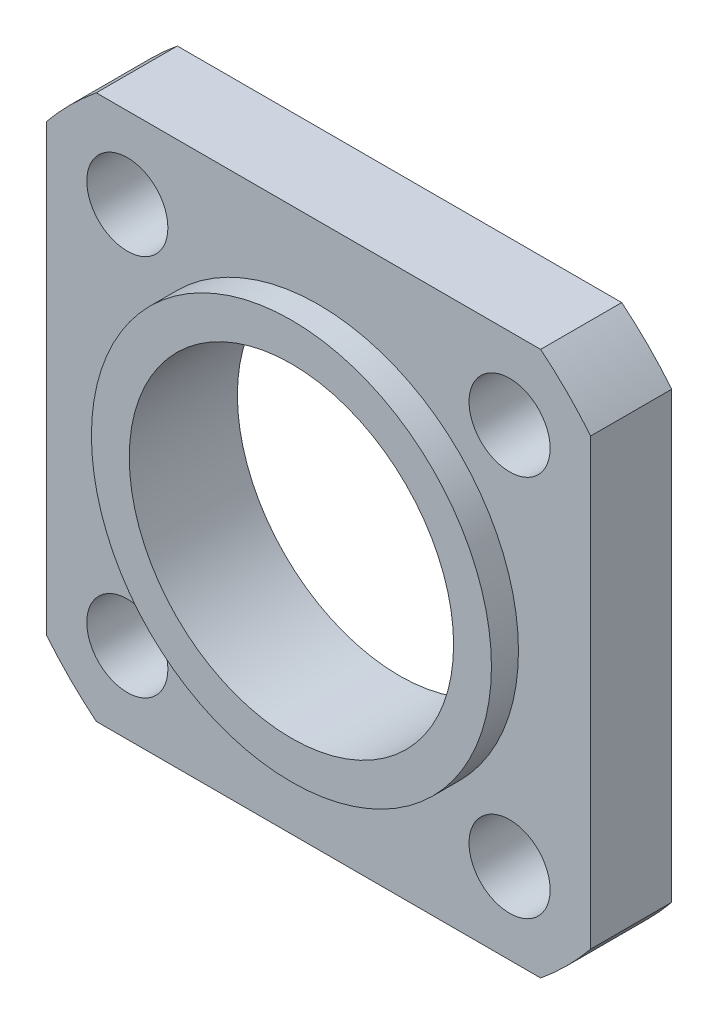
ISO-10303-21;
HEADER;
FILE_DESCRIPTION(('STEP AP214'),'2;1');
FILE_NAME('part.step','',(''),(''),'','','');
FILE_SCHEMA(('AUTOMOTIVE_DESIGN { 1 0 10303 214 1 1 1 1 }'));
ENDSEC;
DATA;
#1=APPLICATION_CONTEXT('core data for automotive mechanical design processes');
#2=APPLICATION_PROTOCOL_DEFINITION('international standard','automotive_design',2000,#1);
#3=PRODUCT_CONTEXT('',#1,'mechanical');
#4=PRODUCT('Part','Part','',(#3));
#5=PRODUCT_RELATED_PRODUCT_CATEGORY('part','',(#4));
#6=PRODUCT_DEFINITION_FORMATION('','',#4);
#7=PRODUCT_DEFINITION_CONTEXT('part definition',#1,'design');
#8=PRODUCT_DEFINITION('design','',#6,#7);
#9=PRODUCT_DEFINITION_SHAPE('','',#8);
#10=(LENGTH_UNIT() NAMED_UNIT(*) SI_UNIT(.MILLI.,.METRE.));
#11=(NAMED_UNIT(*) PLANE_ANGLE_UNIT() SI_UNIT($,.RADIAN.));
#12=(NAMED_UNIT(*) SI_UNIT($,.STERADIAN.) SOLID_ANGLE_UNIT());
#13=UNCERTAINTY_MEASURE_WITH_UNIT(LENGTH_MEASURE(1.E-05),#10,'distance_accuracy_value','');
#14=(GEOMETRIC_REPRESENTATION_CONTEXT(3) GLOBAL_UNCERTAINTY_ASSIGNED_CONTEXT((#13)) GLOBAL_UNIT_ASSIGNED_CONTEXT((#10,
#11,#12)) REPRESENTATION_CONTEXT('',''));
#15=CARTESIAN_POINT('',(0.,0.,0.));
#16=DIRECTION('',(0.,0.,1.));
#17=DIRECTION('',(1.,0.,0.));
#18=AXIS2_PLACEMENT_3D('',#15,#16,#17);
#19=CARTESIAN_POINT('',(0.,0.,3.));
#20=DIRECTION('',(0.,0.,-1.));
#21=DIRECTION('',(-1.,0.,0.));
#22=AXIS2_PLACEMENT_3D('',#19,#20,#21);
#23=CYLINDRICAL_SURFACE('',#22,13.);
#24=CARTESIAN_POINT('',(0.,0.,3.));
#25=DIRECTION('',(0.,0.,1.));
#26=DIRECTION('',(1.,0.,0.));
#27=AXIS2_PLACEMENT_3D('',#24,#25,#26);
#28=CIRCLE('',#27,13.);
#29=CARTESIAN_POINT('',(-8.22031587767818,10.0710678118654,3.));
#30=VERTEX_POINT('',#29);
#31=CARTESIAN_POINT('',(-10.0710678118654,8.22031587767818,3.));
#32=VERTEX_POINT('',#31);
#33=EDGE_CURVE('E118',#30,#32,#28,.T.);
#34=ORIENTED_EDGE('',*,*,#33,.F.);
#35=DIRECTION('',(0.,0.,-1.));
#36=VECTOR('',#35,1.);
#37=CARTESIAN_POINT('',(-8.22031587767818,10.0710678118654,3.));
#38=LINE('',#37,#36);
#39=CARTESIAN_POINT('',(-8.22031587767818,10.0710678118654,0.));
#40=VERTEX_POINT('',#39);
#41=EDGE_CURVE('E11',#30,#40,#38,.T.);
#42=ORIENTED_EDGE('',*,*,#41,.T.);
#43=CARTESIAN_POINT('',(0.,0.,0.));
#44=DIRECTION('',(0.,0.,1.));
#45=DIRECTION('',(1.,0.,0.));
#46=AXIS2_PLACEMENT_3D('',#43,#44,#45);
#47=CIRCLE('',#46,13.);
#48=CARTESIAN_POINT('',(-10.0710678118654,8.22031587767818,0.));
#49=VERTEX_POINT('',#48);
#50=EDGE_CURVE('E141',#40,#49,#47,.T.);
#51=ORIENTED_EDGE('',*,*,#50,.T.);
#52=DIRECTION('',(0.,0.,-1.));
#53=VECTOR('',#52,1.);
#54=CARTESIAN_POINT('',(-10.0710678118654,8.22031587767818,3.));
#55=LINE('',#54,#53);
#56=EDGE_CURVE('E125',#49,#32,#55,.F.);
#57=ORIENTED_EDGE('',*,*,#56,.T.);
#58=EDGE_LOOP('',(#34,#42,#51,#57));
#59=FACE_BOUND('',#58,.T.);
#60=ADVANCED_FACE('F38',(#59),#23,.T.);
#61=CARTESIAN_POINT('',(10.0710678118654,8.22031587767818,0.));
#62=VERTEX_POINT('',#61);
#63=CARTESIAN_POINT('',(8.22031587767818,10.0710678118654,0.));
#64=VERTEX_POINT('',#63);
#65=EDGE_CURVE('E137',#62,#64,#47,.T.);
#66=ORIENTED_EDGE('',*,*,#65,.T.);
#67=DIRECTION('',(0.,0.,-1.));
#68=VECTOR('',#67,1.);
#69=CARTESIAN_POINT('',(8.22031587767818,10.0710678118654,3.));
#70=LINE('',#69,#68);
#71=CARTESIAN_POINT('',(8.22031587767818,10.0710678118654,3.));
#72=VERTEX_POINT('',#71);
#73=EDGE_CURVE('E47',#64,#72,#70,.F.);
#74=ORIENTED_EDGE('',*,*,#73,.T.);
#75=CARTESIAN_POINT('',(10.0710678118654,8.22031587767818,3.));
#76=VERTEX_POINT('',#75);
#77=EDGE_CURVE('E120',#76,#72,#28,.T.);
#78=ORIENTED_EDGE('',*,*,#77,.F.);
#79=DIRECTION('',(0.,0.,-1.));
#80=VECTOR('',#79,1.);
#81=CARTESIAN_POINT('',(10.0710678118654,8.22031587767818,3.));
#82=LINE('',#81,#80);
#83=EDGE_CURVE('E159',#76,#62,#82,.T.);
#84=ORIENTED_EDGE('',*,*,#83,.T.);
#85=EDGE_LOOP('',(#66,#74,#78,#84));
#86=FACE_BOUND('',#85,.T.);
#87=ADVANCED_FACE('F164',(#86),#23,.T.);
#88=CARTESIAN_POINT('',(8.22031587767818,-10.0710678118654,0.));
#89=VERTEX_POINT('',#88);
#90=CARTESIAN_POINT('',(10.0710678118654,-8.22031587767818,0.));
#91=VERTEX_POINT('',#90);
#92=EDGE_CURVE('E142',#89,#91,#47,.T.);
#93=ORIENTED_EDGE('',*,*,#92,.T.);
#94=DIRECTION('',(0.,0.,-1.));
#95=VECTOR('',#94,1.);
#96=CARTESIAN_POINT('',(10.0710678118654,-8.22031587767818,3.));
#97=LINE('',#96,#95);
#98=CARTESIAN_POINT('',(10.0710678118654,-8.22031587767818,3.));
#99=VERTEX_POINT('',#98);
#100=EDGE_CURVE('E156',#91,#99,#97,.F.);
#101=ORIENTED_EDGE('',*,*,#100,.T.);
#102=CARTESIAN_POINT('',(8.22031587767818,-10.0710678118654,3.));
#103=VERTEX_POINT('',#102);
#104=EDGE_CURVE('E131',#103,#99,#28,.T.);
#105=ORIENTED_EDGE('',*,*,#104,.F.);
#106=DIRECTION('',(0.,0.,-1.));
#107=VECTOR('',#106,1.);
#108=CARTESIAN_POINT('',(8.22031587767818,-10.0710678118654,3.));
#109=LINE('',#108,#107);
#110=EDGE_CURVE('E152',#103,#89,#109,.T.);
#111=ORIENTED_EDGE('',*,*,#110,.T.);
#112=EDGE_LOOP('',(#93,#101,#105,#111));
#113=FACE_BOUND('',#112,.T.);
#114=ADVANCED_FACE('F245',(#113),#23,.T.);
#115=CARTESIAN_POINT('',(0.,0.,3.));
#116=DIRECTION('',(0.,0.,1.));
#117=DIRECTION('',(1.,0.,0.));
#118=AXIS2_PLACEMENT_3D('',#115,#116,#117);
#119=PLANE('',#118);
#120=DIRECTION('',(1.,0.,0.));
#121=VECTOR('',#120,1.);
#122=CARTESIAN_POINT('',(-8.22031587767818,10.0710678118654,3.));
#123=LINE('',#122,#121);
#124=EDGE_CURVE('E104',#30,#72,#123,.T.);
#125=ORIENTED_EDGE('',*,*,#124,.F.);
#126=ORIENTED_EDGE('',*,*,#33,.T.);
#127=DIRECTION('',(0.,1.,0.));
#128=VECTOR('',#127,1.);
#129=CARTESIAN_POINT('',(-10.0710678118654,-8.22031587767818,3.));
#130=LINE('',#129,#128);
#131=CARTESIAN_POINT('',(-10.0710678118654,-8.22031587767818,3.));
#132=VERTEX_POINT('',#131);
#133=EDGE_CURVE('E382',#132,#32,#130,.T.);
#134=ORIENTED_EDGE('',*,*,#133,.F.);
#135=CARTESIAN_POINT('',(-8.22031587767818,-10.0710678118654,3.));
#136=VERTEX_POINT('',#135);
#137=EDGE_CURVE('E127',#132,#136,#28,.T.);
#138=ORIENTED_EDGE('',*,*,#137,.T.);
#139=DIRECTION('',(-1.,0.,0.));
#140=VECTOR('',#139,1.);
#141=CARTESIAN_POINT('',(8.22031587767818,-10.0710678118654,3.));
#142=LINE('',#141,#140);
#143=EDGE_CURVE('E62',#103,#136,#142,.T.);
#144=ORIENTED_EDGE('',*,*,#143,.F.);
#145=ORIENTED_EDGE('',*,*,#104,.T.);
#146=DIRECTION('',(0.,-1.,0.));
#147=VECTOR('',#146,1.);
#148=CARTESIAN_POINT('',(10.0710678118654,8.22031587767818,3.));
#149=LINE('',#148,#147);
#150=EDGE_CURVE('E54',#76,#99,#149,.T.);
#151=ORIENTED_EDGE('',*,*,#150,.F.);
#152=ORIENTED_EDGE('',*,*,#77,.T.);
#153=EDGE_LOOP('',(#125,#126,#134,#138,#144,#145,#151,#152));
#154=FACE_BOUND('',#153,.T.);
#155=CARTESIAN_POINT('',(-7.07106781186543,-7.07106781186552,3.));
#156=DIRECTION('',(0.,0.,1.));
#157=DIRECTION('',(1.,0.,0.));
#158=AXIS2_PLACEMENT_3D('',#155,#156,#157);
#159=CIRCLE('',#158,1.5);
#160=CARTESIAN_POINT('',(-5.57106781186543,-7.07106781186552,3.));
#161=VERTEX_POINT('',#160);
#162=EDGE_CURVE('E192',#161,#161,#159,.T.);
#163=ORIENTED_EDGE('',*,*,#162,.F.);
#164=EDGE_LOOP('',(#163));
#165=FACE_BOUND('',#164,.T.);
#166=CARTESIAN_POINT('',(7.07106781186543,7.07106781186551,3.));
#167=DIRECTION('',(0.,0.,1.));
#168=DIRECTION('',(1.,0.,0.));
#169=AXIS2_PLACEMENT_3D('',#166,#167,#168);
#170=CIRCLE('',#169,1.5);
#171=CARTESIAN_POINT('',(8.57106781186543,7.07106781186551,3.));
#172=VERTEX_POINT('',#171);
#173=EDGE_CURVE('E208',#172,#172,#170,.T.);
#174=ORIENTED_EDGE('',*,*,#173,.F.);
#175=EDGE_LOOP('',(#174));
#176=FACE_BOUND('',#175,.T.);
#177=CARTESIAN_POINT('',(-7.07106781186551,7.07106781186543,3.));
#178=DIRECTION('',(0.,0.,1.));
#179=DIRECTION('',(1.,0.,0.));
#180=AXIS2_PLACEMENT_3D('',#177,#178,#179);
#181=CIRCLE('',#180,1.5);
#182=CARTESIAN_POINT('',(-5.57106781186551,7.07106781186543,3.));
#183=VERTEX_POINT('',#182);
#184=EDGE_CURVE('E216',#183,#183,#181,.T.);
#185=ORIENTED_EDGE('',*,*,#184,.F.);
#186=EDGE_LOOP('',(#185));
#187=FACE_BOUND('',#186,.T.);
#188=CARTESIAN_POINT('',(7.07106781186552,-7.07106781186543,3.));
#189=DIRECTION('',(0.,0.,1.));
#190=DIRECTION('',(1.,0.,0.));
#191=AXIS2_PLACEMENT_3D('',#188,#189,#190);
#192=CIRCLE('',#191,1.5);
#193=CARTESIAN_POINT('',(8.57106781186551,-7.07106781186543,3.));
#194=VERTEX_POINT('',#193);
#195=EDGE_CURVE('E200',#194,#194,#192,.T.);
#196=ORIENTED_EDGE('',*,*,#195,.F.);
#197=EDGE_LOOP('',(#196));
#198=FACE_BOUND('',#197,.T.);
#199=CARTESIAN_POINT('',(0.,0.,3.));
#200=DIRECTION('',(0.,0.,1.));
#201=DIRECTION('',(1.,0.,0.));
#202=AXIS2_PLACEMENT_3D('',#199,#200,#201);
#203=CIRCLE('',#202,7.4);
#204=CARTESIAN_POINT('',(7.4,0.,3.));
#205=VERTEX_POINT('',#204);
#206=EDGE_CURVE('E178',#205,#205,#203,.T.);
#207=ORIENTED_EDGE('',*,*,#206,.F.);
#208=EDGE_LOOP('',(#207));
#209=FACE_BOUND('',#208,.T.);
#210=ADVANCED_FACE('F115',(#154,#165,#176,#187,#198,#209),#119,.T.);
#211=CARTESIAN_POINT('',(0.,0.,0.));
#212=DIRECTION('',(0.,0.,1.));
#213=DIRECTION('',(1.,0.,0.));
#214=AXIS2_PLACEMENT_3D('',#211,#212,#213);
#215=PLANE('',#214);
#216=ORIENTED_EDGE('',*,*,#50,.F.);
#217=DIRECTION('',(1.,0.,0.));
#218=VECTOR('',#217,1.);
#219=CARTESIAN_POINT('',(0.,10.0710678118654,0.));
#220=LINE('',#219,#218);
#221=EDGE_CURVE('E107',#40,#64,#220,.T.);
#222=ORIENTED_EDGE('',*,*,#221,.T.);
#223=ORIENTED_EDGE('',*,*,#65,.F.);
#224=DIRECTION('',(0.,-1.,0.));
#225=VECTOR('',#224,1.);
#226=CARTESIAN_POINT('',(10.0710678118654,0.,0.));
#227=LINE('',#226,#225);
#228=EDGE_CURVE('E173',#62,#91,#227,.T.);
#229=ORIENTED_EDGE('',*,*,#228,.T.);
#230=ORIENTED_EDGE('',*,*,#92,.F.);
#231=DIRECTION('',(-1.,0.,0.));
#232=VECTOR('',#231,1.);
#233=CARTESIAN_POINT('',(0.,-10.0710678118654,0.));
#234=LINE('',#233,#232);
#235=CARTESIAN_POINT('',(-8.22031587767818,-10.0710678118654,0.));
#236=VERTEX_POINT('',#235);
#237=EDGE_CURVE('E180',#89,#236,#234,.T.);
#238=ORIENTED_EDGE('',*,*,#237,.T.);
#239=CARTESIAN_POINT('',(-10.0710678118654,-8.22031587767818,0.));
#240=VERTEX_POINT('',#239);
#241=EDGE_CURVE('E265',#240,#236,#47,.T.);
#242=ORIENTED_EDGE('',*,*,#241,.F.);
#243=DIRECTION('',(0.,1.,0.));
#244=VECTOR('',#243,1.);
#245=CARTESIAN_POINT('',(-10.0710678118654,0.,0.));
#246=LINE('',#245,#244);
#247=EDGE_CURVE('E122',#240,#49,#246,.T.);
#248=ORIENTED_EDGE('',*,*,#247,.T.);
#249=EDGE_LOOP('',(#216,#222,#223,#229,#230,#238,#242,#248));
#250=FACE_BOUND('',#249,.T.);
#251=CARTESIAN_POINT('',(0.,0.,0.));
#252=DIRECTION('',(0.,0.,1.));
#253=DIRECTION('',(1.,0.,0.));
#254=AXIS2_PLACEMENT_3D('',#251,#252,#253);
#255=CIRCLE('',#254,6.);
#256=CARTESIAN_POINT('',(6.,0.,0.));
#257=VERTEX_POINT('',#256);
#258=EDGE_CURVE('E135',#257,#257,#255,.T.);
#259=ORIENTED_EDGE('',*,*,#258,.T.);
#260=EDGE_LOOP('',(#259));
#261=FACE_BOUND('',#260,.T.);
#262=CARTESIAN_POINT('',(-7.07106781186551,7.07106781186543,0.));
#263=DIRECTION('',(0.,0.,1.));
#264=DIRECTION('',(1.,0.,0.));
#265=AXIS2_PLACEMENT_3D('',#262,#263,#264);
#266=CIRCLE('',#265,1.5);
#267=CARTESIAN_POINT('',(-5.57106781186551,7.07106781186543,0.));
#268=VERTEX_POINT('',#267);
#269=EDGE_CURVE('E212',#268,#268,#266,.T.);
#270=ORIENTED_EDGE('',*,*,#269,.T.);
#271=EDGE_LOOP('',(#270));
#272=FACE_BOUND('',#271,.T.);
#273=CARTESIAN_POINT('',(7.07106781186543,7.07106781186551,0.));
#274=DIRECTION('',(0.,0.,1.));
#275=DIRECTION('',(1.,0.,0.));
#276=AXIS2_PLACEMENT_3D('',#273,#274,#275);
#277=CIRCLE('',#276,1.5);
#278=CARTESIAN_POINT('',(8.57106781186543,7.07106781186551,0.));
#279=VERTEX_POINT('',#278);
#280=EDGE_CURVE('E204',#279,#279,#277,.T.);
#281=ORIENTED_EDGE('',*,*,#280,.T.);
#282=EDGE_LOOP('',(#281));
#283=FACE_BOUND('',#282,.T.);
#284=CARTESIAN_POINT('',(7.07106781186552,-7.07106781186543,0.));
#285=DIRECTION('',(0.,0.,1.));
#286=DIRECTION('',(1.,0.,0.));
#287=AXIS2_PLACEMENT_3D('',#284,#285,#286);
#288=CIRCLE('',#287,1.5);
#289=CARTESIAN_POINT('',(8.57106781186551,-7.07106781186543,0.));
#290=VERTEX_POINT('',#289);
#291=EDGE_CURVE('E196',#290,#290,#288,.T.);
#292=ORIENTED_EDGE('',*,*,#291,.T.);
#293=EDGE_LOOP('',(#292));
#294=FACE_BOUND('',#293,.T.);
#295=CARTESIAN_POINT('',(-7.07106781186543,-7.07106781186552,0.));
#296=DIRECTION('',(0.,0.,1.));
#297=DIRECTION('',(1.,0.,0.));
#298=AXIS2_PLACEMENT_3D('',#295,#296,#297);
#299=CIRCLE('',#298,1.5);
#300=CARTESIAN_POINT('',(-5.57106781186543,-7.07106781186552,0.));
#301=VERTEX_POINT('',#300);
#302=EDGE_CURVE('E188',#301,#301,#299,.T.);
#303=ORIENTED_EDGE('',*,*,#302,.T.);
#304=EDGE_LOOP('',(#303));
#305=FACE_BOUND('',#304,.T.);
#306=ADVANCED_FACE('F167',(#250,#261,#272,#283,#294,#305),#215,.F.);
#307=ORIENTED_EDGE('',*,*,#241,.T.);
#308=DIRECTION('',(0.,0.,-1.));
#309=VECTOR('',#308,1.);
#310=CARTESIAN_POINT('',(-8.22031587767818,-10.0710678118654,3.));
#311=LINE('',#310,#309);
#312=EDGE_CURVE('E149',#236,#136,#311,.F.);
#313=ORIENTED_EDGE('',*,*,#312,.T.);
#314=ORIENTED_EDGE('',*,*,#137,.F.);
#315=DIRECTION('',(0.,0.,-1.));
#316=VECTOR('',#315,1.);
#317=CARTESIAN_POINT('',(-10.0710678118654,-8.22031587767818,3.));
#318=LINE('',#317,#316);
#319=EDGE_CURVE('E145',#132,#240,#318,.T.);
#320=ORIENTED_EDGE('',*,*,#319,.T.);
#321=EDGE_LOOP('',(#307,#313,#314,#320));
#322=FACE_BOUND('',#321,.T.);
#323=ADVANCED_FACE('F40',(#322),#23,.T.);
#324=CARTESIAN_POINT('',(0.,0.,3.));
#325=DIRECTION('',(0.,0.,-1.));
#326=DIRECTION('',(-1.,0.,0.));
#327=AXIS2_PLACEMENT_3D('',#324,#325,#326);
#328=CYLINDRICAL_SURFACE('',#327,6.);
#329=ORIENTED_EDGE('',*,*,#258,.F.);
#330=EDGE_LOOP('',(#329));
#331=FACE_BOUND('',#330,.T.);
#332=CARTESIAN_POINT('',(0.,0.,4.));
#333=DIRECTION('',(0.,0.,1.));
#334=DIRECTION('',(1.,0.,0.));
#335=AXIS2_PLACEMENT_3D('',#332,#333,#334);
#336=CIRCLE('',#335,6.);
#337=CARTESIAN_POINT('',(6.,0.,4.));
#338=VERTEX_POINT('',#337);
#339=EDGE_CURVE('E172',#338,#338,#336,.T.);
#340=ORIENTED_EDGE('',*,*,#339,.T.);
#341=EDGE_LOOP('',(#340));
#342=FACE_BOUND('',#341,.T.);
#343=ADVANCED_FACE('F228',(#331,#342),#328,.F.);
#344=CARTESIAN_POINT('',(-7.07106781186551,7.07106781186543,3.));
#345=DIRECTION('',(0.,0.,-1.));
#346=DIRECTION('',(-1.,0.,0.));
#347=AXIS2_PLACEMENT_3D('',#344,#345,#346);
#348=CYLINDRICAL_SURFACE('',#347,1.5);
#349=ORIENTED_EDGE('',*,*,#184,.T.);
#350=EDGE_LOOP('',(#349));
#351=FACE_BOUND('',#350,.T.);
#352=ORIENTED_EDGE('',*,*,#269,.F.);
#353=EDGE_LOOP('',(#352));
#354=FACE_BOUND('',#353,.T.);
#355=ADVANCED_FACE('F225',(#351,#354),#348,.F.);
#356=CARTESIAN_POINT('',(7.07106781186543,7.07106781186551,3.));
#357=DIRECTION('',(0.,0.,-1.));
#358=DIRECTION('',(-1.,0.,0.));
#359=AXIS2_PLACEMENT_3D('',#356,#357,#358);
#360=CYLINDRICAL_SURFACE('',#359,1.5);
#361=ORIENTED_EDGE('',*,*,#173,.T.);
#362=EDGE_LOOP('',(#361));
#363=FACE_BOUND('',#362,.T.);
#364=ORIENTED_EDGE('',*,*,#280,.F.);
#365=EDGE_LOOP('',(#364));
#366=FACE_BOUND('',#365,.T.);
#367=ADVANCED_FACE('F227',(#363,#366),#360,.F.);
#368=CARTESIAN_POINT('',(7.07106781186552,-7.07106781186543,3.));
#369=DIRECTION('',(0.,0.,-1.));
#370=DIRECTION('',(-1.,0.,0.));
#371=AXIS2_PLACEMENT_3D('',#368,#369,#370);
#372=CYLINDRICAL_SURFACE('',#371,1.5);
#373=ORIENTED_EDGE('',*,*,#195,.T.);
#374=EDGE_LOOP('',(#373));
#375=FACE_BOUND('',#374,.T.);
#376=ORIENTED_EDGE('',*,*,#291,.F.);
#377=EDGE_LOOP('',(#376));
#378=FACE_BOUND('',#377,.T.);
#379=ADVANCED_FACE('F235',(#375,#378),#372,.F.);
#380=CARTESIAN_POINT('',(-7.07106781186543,-7.07106781186552,3.));
#381=DIRECTION('',(0.,0.,-1.));
#382=DIRECTION('',(-1.,0.,0.));
#383=AXIS2_PLACEMENT_3D('',#380,#381,#382);
#384=CYLINDRICAL_SURFACE('',#383,1.5);
#385=ORIENTED_EDGE('',*,*,#162,.T.);
#386=EDGE_LOOP('',(#385));
#387=FACE_BOUND('',#386,.T.);
#388=ORIENTED_EDGE('',*,*,#302,.F.);
#389=EDGE_LOOP('',(#388));
#390=FACE_BOUND('',#389,.T.);
#391=ADVANCED_FACE('F276',(#387,#390),#384,.F.);
#392=CARTESIAN_POINT('',(0.,0.,4.));
#393=DIRECTION('',(0.,0.,1.));
#394=DIRECTION('',(1.,0.,0.));
#395=AXIS2_PLACEMENT_3D('',#392,#393,#394);
#396=PLANE('',#395);
#397=CARTESIAN_POINT('',(0.,0.,4.));
#398=DIRECTION('',(0.,0.,1.));
#399=DIRECTION('',(1.,0.,0.));
#400=AXIS2_PLACEMENT_3D('',#397,#398,#399);
#401=CIRCLE('',#400,7.4);
#402=CARTESIAN_POINT('',(7.4,0.,4.));
#403=VERTEX_POINT('',#402);
#404=EDGE_CURVE('E184',#403,#403,#401,.T.);
#405=ORIENTED_EDGE('',*,*,#404,.T.);
#406=EDGE_LOOP('',(#405));
#407=FACE_BOUND('',#406,.T.);
#408=ORIENTED_EDGE('',*,*,#339,.F.);
#409=EDGE_LOOP('',(#408));
#410=FACE_BOUND('',#409,.T.);
#411=ADVANCED_FACE('F273',(#407,#410),#396,.T.);
#412=CARTESIAN_POINT('',(0.,0.,4.));
#413=DIRECTION('',(0.,0.,-1.));
#414=DIRECTION('',(-1.,0.,0.));
#415=AXIS2_PLACEMENT_3D('',#412,#413,#414);
#416=CYLINDRICAL_SURFACE('',#415,7.4);
#417=ORIENTED_EDGE('',*,*,#404,.F.);
#418=EDGE_LOOP('',(#417));
#419=FACE_BOUND('',#418,.T.);
#420=ORIENTED_EDGE('',*,*,#206,.T.);
#421=EDGE_LOOP('',(#420));
#422=FACE_BOUND('',#421,.T.);
#423=ADVANCED_FACE('F275',(#419,#422),#416,.T.);
#424=CARTESIAN_POINT('',(-10.0710678118654,-8.22031587767818,-38.));
#425=DIRECTION('',(1.,0.,0.));
#426=DIRECTION('',(0.,1.,0.));
#427=AXIS2_PLACEMENT_3D('',#424,#425,#426);
#428=PLANE('',#427);
#429=ORIENTED_EDGE('',*,*,#319,.F.);
#430=ORIENTED_EDGE('',*,*,#133,.T.);
#431=ORIENTED_EDGE('',*,*,#56,.F.);
#432=ORIENTED_EDGE('',*,*,#247,.F.);
#433=EDGE_LOOP('',(#429,#430,#431,#432));
#434=FACE_BOUND('',#433,.T.);
#435=ADVANCED_FACE('F283',(#434),#428,.F.);
#436=CARTESIAN_POINT('',(8.22031587767818,-10.0710678118654,-38.));
#437=DIRECTION('',(0.,1.,0.));
#438=DIRECTION('',(-1.,0.,0.));
#439=AXIS2_PLACEMENT_3D('',#436,#437,#438);
#440=PLANE('',#439);
#441=ORIENTED_EDGE('',*,*,#110,.F.);
#442=ORIENTED_EDGE('',*,*,#143,.T.);
#443=ORIENTED_EDGE('',*,*,#312,.F.);
#444=ORIENTED_EDGE('',*,*,#237,.F.);
#445=EDGE_LOOP('',(#441,#442,#443,#444));
#446=FACE_BOUND('',#445,.T.);
#447=ADVANCED_FACE('F351',(#446),#440,.F.);
#448=CARTESIAN_POINT('',(10.0710678118654,8.22031587767818,-38.));
#449=DIRECTION('',(-1.,0.,0.));
#450=DIRECTION('',(0.,0.,1.));
#451=AXIS2_PLACEMENT_3D('',#448,#449,#450);
#452=PLANE('',#451);
#453=ORIENTED_EDGE('',*,*,#83,.F.);
#454=ORIENTED_EDGE('',*,*,#150,.T.);
#455=ORIENTED_EDGE('',*,*,#100,.F.);
#456=ORIENTED_EDGE('',*,*,#228,.F.);
#457=EDGE_LOOP('',(#453,#454,#455,#456));
#458=FACE_BOUND('',#457,.T.);
#459=ADVANCED_FACE('F357',(#458),#452,.F.);
#460=CARTESIAN_POINT('',(-8.22031587767818,10.0710678118654,-38.));
#461=DIRECTION('',(0.,-1.,0.));
#462=DIRECTION('',(0.,0.,-1.));
#463=AXIS2_PLACEMENT_3D('',#460,#461,#462);
#464=PLANE('',#463);
#465=ORIENTED_EDGE('',*,*,#41,.F.);
#466=ORIENTED_EDGE('',*,*,#124,.T.);
#467=ORIENTED_EDGE('',*,*,#73,.F.);
#468=ORIENTED_EDGE('',*,*,#221,.F.);
#469=EDGE_LOOP('',(#465,#466,#467,#468));
#470=FACE_BOUND('',#469,.T.);
#471=ADVANCED_FACE('F103',(#470),#464,.F.);
#472=CLOSED_SHELL('',(#60,#87,#114,#210,#306,#323,#343,#355,#367,#379,#391,#411,#423,#435,#447,
#459,#471));
#473=MANIFOLD_SOLID_BREP('B2',#472);
#474=ADVANCED_BREP_SHAPE_REPRESENTATION('',(#18,#473),#14);
#475=SHAPE_DEFINITION_REPRESENTATION(#9,#474);
ENDSEC;
END-ISO-10303-21;
